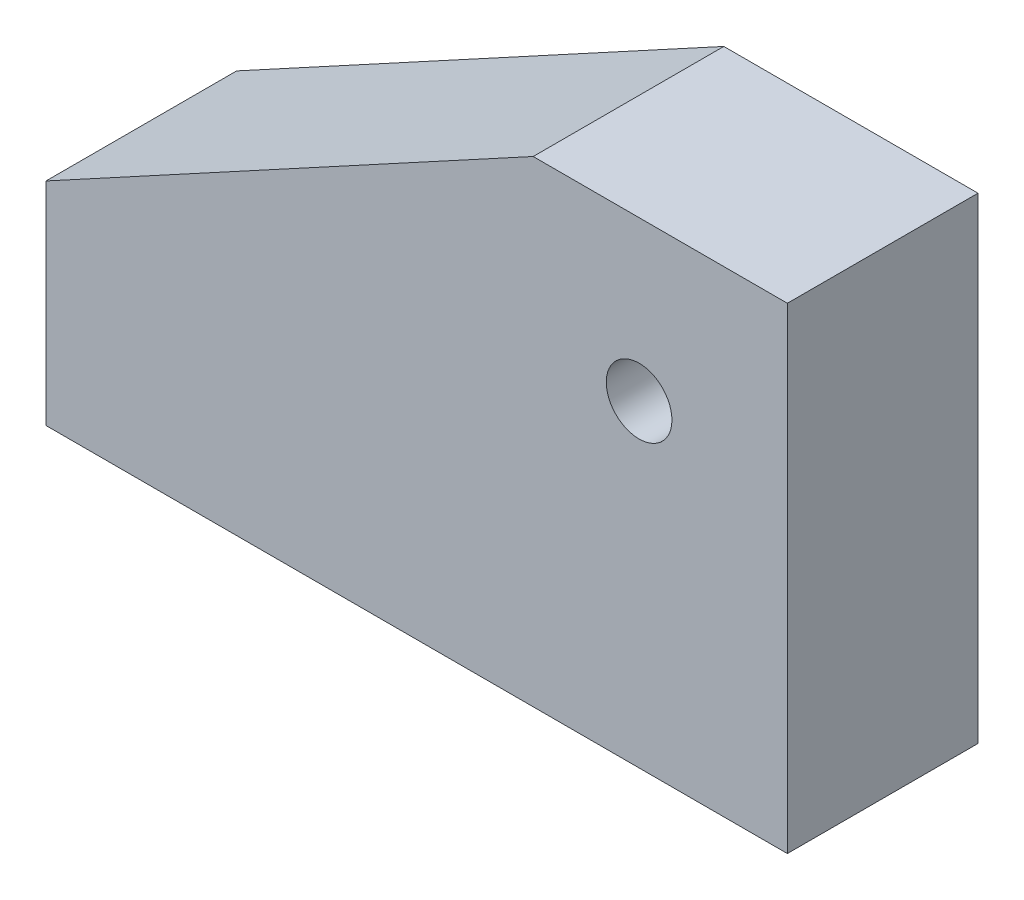
ISO-10303-21;
HEADER;
FILE_DESCRIPTION(('STEP AP214'),'2;1');
FILE_NAME('part.step','',(''),(''),'','','');
FILE_SCHEMA(('AUTOMOTIVE_DESIGN { 1 0 10303 214 1 1 1 1 }'));
ENDSEC;
DATA;
#1=APPLICATION_CONTEXT('core data for automotive mechanical design processes');
#2=APPLICATION_PROTOCOL_DEFINITION('international standard','automotive_design',2000,#1);
#3=PRODUCT_CONTEXT('',#1,'mechanical');
#4=PRODUCT('Part','Part','',(#3));
#5=PRODUCT_RELATED_PRODUCT_CATEGORY('part','',(#4));
#6=PRODUCT_DEFINITION_FORMATION('','',#4);
#7=PRODUCT_DEFINITION_CONTEXT('part definition',#1,'design');
#8=PRODUCT_DEFINITION('design','',#6,#7);
#9=PRODUCT_DEFINITION_SHAPE('','',#8);
#10=(LENGTH_UNIT() NAMED_UNIT(*) SI_UNIT(.MILLI.,.METRE.));
#11=(NAMED_UNIT(*) PLANE_ANGLE_UNIT() SI_UNIT($,.RADIAN.));
#12=(NAMED_UNIT(*) SI_UNIT($,.STERADIAN.) SOLID_ANGLE_UNIT());
#13=UNCERTAINTY_MEASURE_WITH_UNIT(LENGTH_MEASURE(1.E-05),#10,'distance_accuracy_value','');
#14=(GEOMETRIC_REPRESENTATION_CONTEXT(3) GLOBAL_UNCERTAINTY_ASSIGNED_CONTEXT((#13)) GLOBAL_UNIT_ASSIGNED_CONTEXT((#10,
#11,#12)) REPRESENTATION_CONTEXT('',''));
#15=CARTESIAN_POINT('',(0.,0.,0.));
#16=DIRECTION('',(0.,0.,1.));
#17=DIRECTION('',(1.,0.,0.));
#18=AXIS2_PLACEMENT_3D('',#15,#16,#17);
#19=CARTESIAN_POINT('',(0.,0.,9.));
#20=DIRECTION('',(0.,0.,1.));
#21=DIRECTION('',(1.,0.,0.));
#22=AXIS2_PLACEMENT_3D('',#19,#20,#21);
#23=PLANE('',#22);
#24=DIRECTION('',(0.,-1.,0.));
#25=VECTOR('',#24,1.);
#26=CARTESIAN_POINT('',(-35.,20.,9.));
#27=LINE('',#26,#25);
#28=CARTESIAN_POINT('',(-35.,20.,9.));
#29=VERTEX_POINT('',#28);
#30=CARTESIAN_POINT('',(-35.,0.,9.));
#31=VERTEX_POINT('',#30);
#32=EDGE_CURVE('E139',#29,#31,#27,.T.);
#33=ORIENTED_EDGE('',*,*,#32,.T.);
#34=DIRECTION('',(1.,0.,0.));
#35=VECTOR('',#34,1.);
#36=CARTESIAN_POINT('',(-35.,0.,9.));
#37=LINE('',#36,#35);
#38=CARTESIAN_POINT('',(35.,0.,9.));
#39=VERTEX_POINT('',#38);
#40=EDGE_CURVE('E97',#31,#39,#37,.T.);
#41=ORIENTED_EDGE('',*,*,#40,.T.);
#42=DIRECTION('',(0.,1.,0.));
#43=VECTOR('',#42,1.);
#44=CARTESIAN_POINT('',(35.,0.,9.));
#45=LINE('',#44,#43);
#46=CARTESIAN_POINT('',(35.,45.,9.));
#47=VERTEX_POINT('',#46);
#48=EDGE_CURVE('E101',#39,#47,#45,.T.);
#49=ORIENTED_EDGE('',*,*,#48,.T.);
#50=DIRECTION('',(-1.,0.,0.));
#51=VECTOR('',#50,1.);
#52=CARTESIAN_POINT('',(35.,45.,9.));
#53=LINE('',#52,#51);
#54=CARTESIAN_POINT('',(11.,45.,9.));
#55=VERTEX_POINT('',#54);
#56=EDGE_CURVE('E105',#47,#55,#53,.T.);
#57=ORIENTED_EDGE('',*,*,#56,.T.);
#58=DIRECTION('',(-0.878624509572546,-0.477513320419863,0.));
#59=VECTOR('',#58,1.);
#60=CARTESIAN_POINT('',(11.,45.,9.));
#61=LINE('',#60,#59);
#62=EDGE_CURVE('E63',#55,#29,#61,.T.);
#63=ORIENTED_EDGE('',*,*,#62,.T.);
#64=EDGE_LOOP('',(#33,#41,#49,#57,#63));
#65=FACE_BOUND('',#64,.T.);
#66=CARTESIAN_POINT('',(21.,30.,9.));
#67=DIRECTION('',(0.,0.,1.));
#68=DIRECTION('',(1.,0.,0.));
#69=AXIS2_PLACEMENT_3D('',#66,#67,#68);
#70=CIRCLE('',#69,3.1);
#71=CARTESIAN_POINT('',(24.1,30.,9.));
#72=VERTEX_POINT('',#71);
#73=EDGE_CURVE('E130',#72,#72,#70,.T.);
#74=ORIENTED_EDGE('',*,*,#73,.F.);
#75=EDGE_LOOP('',(#74));
#76=FACE_BOUND('',#75,.T.);
#77=ADVANCED_FACE('F45',(#65,#76),#23,.T.);
#78=CARTESIAN_POINT('',(0.,0.,-9.));
#79=DIRECTION('',(0.,0.,1.));
#80=DIRECTION('',(1.,0.,0.));
#81=AXIS2_PLACEMENT_3D('',#78,#79,#80);
#82=PLANE('',#81);
#83=DIRECTION('',(0.,-1.,0.));
#84=VECTOR('',#83,1.);
#85=CARTESIAN_POINT('',(-35.,20.,-9.));
#86=LINE('',#85,#84);
#87=CARTESIAN_POINT('',(-35.,20.,-9.));
#88=VERTEX_POINT('',#87);
#89=CARTESIAN_POINT('',(-35.,0.,-9.));
#90=VERTEX_POINT('',#89);
#91=EDGE_CURVE('E125',#88,#90,#86,.T.);
#92=ORIENTED_EDGE('',*,*,#91,.F.);
#93=DIRECTION('',(-0.878624509572546,-0.477513320419863,0.));
#94=VECTOR('',#93,1.);
#95=CARTESIAN_POINT('',(11.,45.,-9.));
#96=LINE('',#95,#94);
#97=CARTESIAN_POINT('',(11.,45.,-9.));
#98=VERTEX_POINT('',#97);
#99=EDGE_CURVE('E89',#98,#88,#96,.T.);
#100=ORIENTED_EDGE('',*,*,#99,.F.);
#101=DIRECTION('',(-1.,0.,0.));
#102=VECTOR('',#101,1.);
#103=CARTESIAN_POINT('',(35.,45.,-9.));
#104=LINE('',#103,#102);
#105=CARTESIAN_POINT('',(35.,45.,-9.));
#106=VERTEX_POINT('',#105);
#107=EDGE_CURVE('E83',#106,#98,#104,.T.);
#108=ORIENTED_EDGE('',*,*,#107,.F.);
#109=DIRECTION('',(0.,1.,0.));
#110=VECTOR('',#109,1.);
#111=CARTESIAN_POINT('',(35.,0.,-9.));
#112=LINE('',#111,#110);
#113=CARTESIAN_POINT('',(35.,0.,-9.));
#114=VERTEX_POINT('',#113);
#115=EDGE_CURVE('E113',#114,#106,#112,.T.);
#116=ORIENTED_EDGE('',*,*,#115,.F.);
#117=DIRECTION('',(1.,0.,0.));
#118=VECTOR('',#117,1.);
#119=CARTESIAN_POINT('',(-35.,0.,-9.));
#120=LINE('',#119,#118);
#121=EDGE_CURVE('E129',#90,#114,#120,.T.);
#122=ORIENTED_EDGE('',*,*,#121,.F.);
#123=EDGE_LOOP('',(#92,#100,#108,#116,#122));
#124=FACE_BOUND('',#123,.T.);
#125=CARTESIAN_POINT('',(21.,30.,-9.));
#126=DIRECTION('',(0.,0.,1.));
#127=DIRECTION('',(1.,0.,0.));
#128=AXIS2_PLACEMENT_3D('',#125,#126,#127);
#129=CIRCLE('',#128,3.1);
#130=CARTESIAN_POINT('',(24.1,30.,-9.));
#131=VERTEX_POINT('',#130);
#132=EDGE_CURVE('E190',#131,#131,#129,.T.);
#133=ORIENTED_EDGE('',*,*,#132,.T.);
#134=EDGE_LOOP('',(#133));
#135=FACE_BOUND('',#134,.T.);
#136=ADVANCED_FACE('F146',(#124,#135),#82,.F.);
#137=CARTESIAN_POINT('',(-35.,20.,9.));
#138=DIRECTION('',(1.,0.,0.));
#139=DIRECTION('',(0.,0.,-1.));
#140=AXIS2_PLACEMENT_3D('',#137,#138,#139);
#141=PLANE('',#140);
#142=ORIENTED_EDGE('',*,*,#91,.T.);
#143=DIRECTION('',(0.,0.,-1.));
#144=VECTOR('',#143,1.);
#145=CARTESIAN_POINT('',(-35.,0.,9.));
#146=LINE('',#145,#144);
#147=EDGE_CURVE('E11',#31,#90,#146,.T.);
#148=ORIENTED_EDGE('',*,*,#147,.F.);
#149=ORIENTED_EDGE('',*,*,#32,.F.);
#150=DIRECTION('',(0.,0.,-1.));
#151=VECTOR('',#150,1.);
#152=CARTESIAN_POINT('',(-35.,20.,9.));
#153=LINE('',#152,#151);
#154=EDGE_CURVE('E121',#29,#88,#153,.T.);
#155=ORIENTED_EDGE('',*,*,#154,.T.);
#156=EDGE_LOOP('',(#142,#148,#149,#155));
#157=FACE_BOUND('',#156,.T.);
#158=ADVANCED_FACE('F47',(#157),#141,.F.);
#159=CARTESIAN_POINT('',(-35.,0.,9.));
#160=DIRECTION('',(0.,1.,0.));
#161=DIRECTION('',(0.,0.,1.));
#162=AXIS2_PLACEMENT_3D('',#159,#160,#161);
#163=PLANE('',#162);
#164=CARTESIAN_POINT('',(19.,0.,-5.5));
#165=DIRECTION('',(0.,-1.,0.));
#166=DIRECTION('',(0.,0.,-1.));
#167=AXIS2_PLACEMENT_3D('',#164,#165,#166);
#168=CIRCLE('',#167,2.);
#169=CARTESIAN_POINT('',(19.,0.,-7.5));
#170=VERTEX_POINT('',#169);
#171=EDGE_CURVE('E191',#170,#170,#168,.T.);
#172=ORIENTED_EDGE('',*,*,#171,.F.);
#173=EDGE_LOOP('',(#172));
#174=FACE_BOUND('',#173,.T.);
#175=CARTESIAN_POINT('',(-13.,0.,-5.5));
#176=DIRECTION('',(0.,-1.,0.));
#177=DIRECTION('',(0.,0.,-1.));
#178=AXIS2_PLACEMENT_3D('',#175,#176,#177);
#179=CIRCLE('',#178,2.);
#180=CARTESIAN_POINT('',(-13.,0.,-7.5));
#181=VERTEX_POINT('',#180);
#182=EDGE_CURVE('E198',#181,#181,#179,.T.);
#183=ORIENTED_EDGE('',*,*,#182,.F.);
#184=EDGE_LOOP('',(#183));
#185=FACE_BOUND('',#184,.T.);
#186=ORIENTED_EDGE('',*,*,#121,.T.);
#187=DIRECTION('',(0.,0.,-1.));
#188=VECTOR('',#187,1.);
#189=CARTESIAN_POINT('',(35.,0.,9.));
#190=LINE('',#189,#188);
#191=EDGE_CURVE('E55',#39,#114,#190,.T.);
#192=ORIENTED_EDGE('',*,*,#191,.F.);
#193=ORIENTED_EDGE('',*,*,#40,.F.);
#194=ORIENTED_EDGE('',*,*,#147,.T.);
#195=EDGE_LOOP('',(#186,#192,#193,#194));
#196=FACE_BOUND('',#195,.T.);
#197=ADVANCED_FACE('F220',(#174,#185,#196),#163,.F.);
#198=CARTESIAN_POINT('',(35.,0.,9.));
#199=DIRECTION('',(-1.,0.,0.));
#200=DIRECTION('',(0.,-1.,0.));
#201=AXIS2_PLACEMENT_3D('',#198,#199,#200);
#202=PLANE('',#201);
#203=ORIENTED_EDGE('',*,*,#115,.T.);
#204=DIRECTION('',(0.,0.,-1.));
#205=VECTOR('',#204,1.);
#206=CARTESIAN_POINT('',(35.,45.,9.));
#207=LINE('',#206,#205);
#208=EDGE_CURVE('E110',#47,#106,#207,.T.);
#209=ORIENTED_EDGE('',*,*,#208,.F.);
#210=ORIENTED_EDGE('',*,*,#48,.F.);
#211=ORIENTED_EDGE('',*,*,#191,.T.);
#212=EDGE_LOOP('',(#203,#209,#210,#211));
#213=FACE_BOUND('',#212,.T.);
#214=ADVANCED_FACE('F111',(#213),#202,.F.);
#215=CARTESIAN_POINT('',(35.,45.,9.));
#216=DIRECTION('',(0.,-1.,0.));
#217=DIRECTION('',(1.,0.,0.));
#218=AXIS2_PLACEMENT_3D('',#215,#216,#217);
#219=PLANE('',#218);
#220=ORIENTED_EDGE('',*,*,#107,.T.);
#221=DIRECTION('',(0.,0.,-1.));
#222=VECTOR('',#221,1.);
#223=CARTESIAN_POINT('',(11.,45.,9.));
#224=LINE('',#223,#222);
#225=EDGE_CURVE('E115',#55,#98,#224,.T.);
#226=ORIENTED_EDGE('',*,*,#225,.F.);
#227=ORIENTED_EDGE('',*,*,#56,.F.);
#228=ORIENTED_EDGE('',*,*,#208,.T.);
#229=EDGE_LOOP('',(#220,#226,#227,#228));
#230=FACE_BOUND('',#229,.T.);
#231=ADVANCED_FACE('F117',(#230),#219,.F.);
#232=CARTESIAN_POINT('',(11.,45.,9.));
#233=DIRECTION('',(0.477513320419863,-0.878624509572546,0.));
#234=DIRECTION('',(0.878624509572546,0.477513320419863,0.));
#235=AXIS2_PLACEMENT_3D('',#232,#233,#234);
#236=PLANE('',#235);
#237=ORIENTED_EDGE('',*,*,#99,.T.);
#238=ORIENTED_EDGE('',*,*,#154,.F.);
#239=ORIENTED_EDGE('',*,*,#62,.F.);
#240=ORIENTED_EDGE('',*,*,#225,.T.);
#241=EDGE_LOOP('',(#237,#238,#239,#240));
#242=FACE_BOUND('',#241,.T.);
#243=ADVANCED_FACE('F151',(#242),#236,.F.);
#244=CARTESIAN_POINT('',(21.,30.,9.));
#245=DIRECTION('',(0.,0.,-1.));
#246=DIRECTION('',(-1.,0.,0.));
#247=AXIS2_PLACEMENT_3D('',#244,#245,#246);
#248=CYLINDRICAL_SURFACE('',#247,3.1);
#249=ORIENTED_EDGE('',*,*,#73,.T.);
#250=EDGE_LOOP('',(#249));
#251=FACE_BOUND('',#250,.T.);
#252=ORIENTED_EDGE('',*,*,#132,.F.);
#253=EDGE_LOOP('',(#252));
#254=FACE_BOUND('',#253,.T.);
#255=ADVANCED_FACE('F153',(#251,#254),#248,.F.);
#256=CARTESIAN_POINT('',(-13.,10.,-5.5));
#257=DIRECTION('',(0.,-1.,0.));
#258=DIRECTION('',(0.,0.,-1.));
#259=AXIS2_PLACEMENT_3D('',#256,#257,#258);
#260=CYLINDRICAL_SURFACE('',#259,2.);
#261=CARTESIAN_POINT('',(-13.,10.,-5.5));
#262=DIRECTION('',(0.,-1.,0.));
#263=DIRECTION('',(0.,0.,-1.));
#264=AXIS2_PLACEMENT_3D('',#261,#262,#263);
#265=CIRCLE('',#264,2.);
#266=CARTESIAN_POINT('',(-13.,10.,-7.5));
#267=VERTEX_POINT('',#266);
#268=EDGE_CURVE('E204',#267,#267,#265,.T.);
#269=ORIENTED_EDGE('',*,*,#268,.F.);
#270=EDGE_LOOP('',(#269));
#271=FACE_BOUND('',#270,.T.);
#272=ORIENTED_EDGE('',*,*,#182,.T.);
#273=EDGE_LOOP('',(#272));
#274=FACE_BOUND('',#273,.T.);
#275=ADVANCED_FACE('F159',(#271,#274),#260,.F.);
#276=CARTESIAN_POINT('',(-13.,10.,-5.5));
#277=DIRECTION('',(0.,-1.,0.));
#278=DIRECTION('',(0.,0.,-1.));
#279=AXIS2_PLACEMENT_3D('',#276,#277,#278);
#280=PLANE('',#279);
#281=ORIENTED_EDGE('',*,*,#268,.T.);
#282=EDGE_LOOP('',(#281));
#283=FACE_BOUND('',#282,.T.);
#284=ADVANCED_FACE('F170',(#283),#280,.T.);
#285=CARTESIAN_POINT('',(19.,10.,-5.5));
#286=DIRECTION('',(0.,-1.,0.));
#287=DIRECTION('',(0.,0.,-1.));
#288=AXIS2_PLACEMENT_3D('',#285,#286,#287);
#289=CYLINDRICAL_SURFACE('',#288,2.);
#290=CARTESIAN_POINT('',(19.,10.,-5.5));
#291=DIRECTION('',(0.,-1.,0.));
#292=DIRECTION('',(0.,0.,-1.));
#293=AXIS2_PLACEMENT_3D('',#290,#291,#292);
#294=CIRCLE('',#293,2.);
#295=CARTESIAN_POINT('',(19.,10.,-7.5));
#296=VERTEX_POINT('',#295);
#297=EDGE_CURVE('E188',#296,#296,#294,.T.);
#298=ORIENTED_EDGE('',*,*,#297,.F.);
#299=EDGE_LOOP('',(#298));
#300=FACE_BOUND('',#299,.T.);
#301=ORIENTED_EDGE('',*,*,#171,.T.);
#302=EDGE_LOOP('',(#301));
#303=FACE_BOUND('',#302,.T.);
#304=ADVANCED_FACE('F173',(#300,#303),#289,.F.);
#305=CARTESIAN_POINT('',(19.,10.,-5.5));
#306=DIRECTION('',(0.,-1.,0.));
#307=DIRECTION('',(0.,0.,-1.));
#308=AXIS2_PLACEMENT_3D('',#305,#306,#307);
#309=PLANE('',#308);
#310=ORIENTED_EDGE('',*,*,#297,.T.);
#311=EDGE_LOOP('',(#310));
#312=FACE_BOUND('',#311,.T.);
#313=ADVANCED_FACE('F180',(#312),#309,.T.);
#314=CLOSED_SHELL('',(#77,#136,#158,#197,#214,#231,#243,#255,#275,#284,#304,#313));
#315=MANIFOLD_SOLID_BREP('B2',#314);
#316=ADVANCED_BREP_SHAPE_REPRESENTATION('',(#18,#315),#14);
#317=SHAPE_DEFINITION_REPRESENTATION(#9,#316);
ENDSEC;
END-ISO-10303-21;
